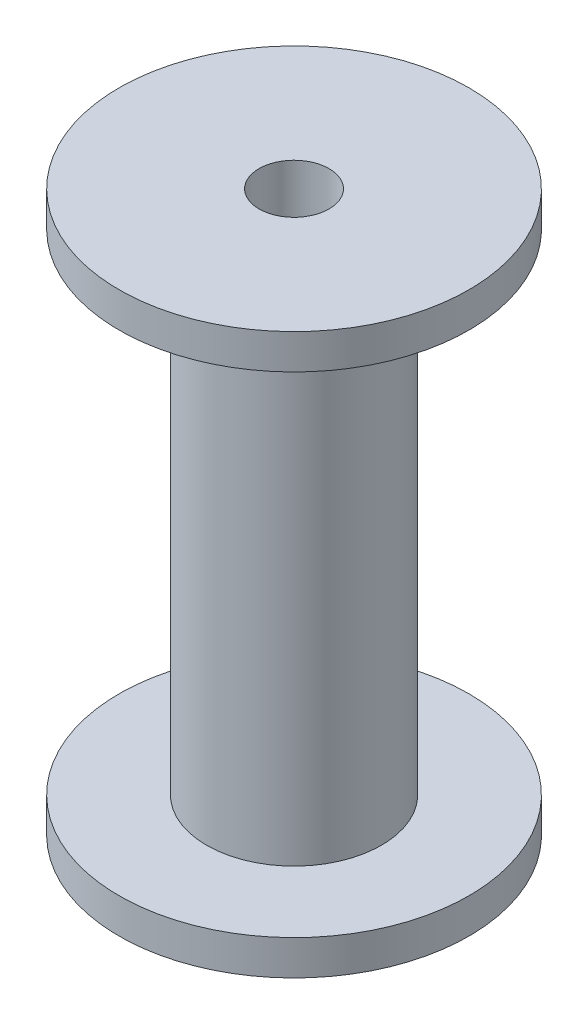
ISO-10303-21;
HEADER;
FILE_DESCRIPTION(('STEP AP214'),'2;1');
FILE_NAME('part.step','',(''),(''),'','','');
FILE_SCHEMA(('AUTOMOTIVE_DESIGN { 1 0 10303 214 1 1 1 1 }'));
ENDSEC;
DATA;
#1=APPLICATION_CONTEXT('core data for automotive mechanical design processes');
#2=APPLICATION_PROTOCOL_DEFINITION('international standard','automotive_design',2000,#1);
#3=PRODUCT_CONTEXT('',#1,'mechanical');
#4=PRODUCT('Part','Part','',(#3));
#5=PRODUCT_RELATED_PRODUCT_CATEGORY('part','',(#4));
#6=PRODUCT_DEFINITION_FORMATION('','',#4);
#7=PRODUCT_DEFINITION_CONTEXT('part definition',#1,'design');
#8=PRODUCT_DEFINITION('design','',#6,#7);
#9=PRODUCT_DEFINITION_SHAPE('','',#8);
#10=(LENGTH_UNIT() NAMED_UNIT(*) SI_UNIT(.MILLI.,.METRE.));
#11=(NAMED_UNIT(*) PLANE_ANGLE_UNIT() SI_UNIT($,.RADIAN.));
#12=(NAMED_UNIT(*) SI_UNIT($,.STERADIAN.) SOLID_ANGLE_UNIT());
#13=UNCERTAINTY_MEASURE_WITH_UNIT(LENGTH_MEASURE(1.E-05),#10,'distance_accuracy_value','');
#14=(GEOMETRIC_REPRESENTATION_CONTEXT(3) GLOBAL_UNCERTAINTY_ASSIGNED_CONTEXT((#13)) GLOBAL_UNIT_ASSIGNED_CONTEXT((#10,
#11,#12)) REPRESENTATION_CONTEXT('',''));
#15=CARTESIAN_POINT('',(0.,0.,0.));
#16=DIRECTION('',(0.,0.,1.));
#17=DIRECTION('',(1.,0.,0.));
#18=AXIS2_PLACEMENT_3D('',#15,#16,#17);
#19=CARTESIAN_POINT('',(63.5,0.,0.));
#20=DIRECTION('',(0.,-1.,0.));
#21=DIRECTION('',(0.,0.,-1.));
#22=AXIS2_PLACEMENT_3D('',#19,#20,#21);
#23=PLANE('',#22);
#24=CARTESIAN_POINT('',(0.,0.,0.));
#25=DIRECTION('',(0.,1.,0.));
#26=DIRECTION('',(0.,0.,1.));
#27=AXIS2_PLACEMENT_3D('',#24,#25,#26);
#28=CIRCLE('',#27,12.7);
#29=CARTESIAN_POINT('',(0.,0.,12.7));
#30=VERTEX_POINT('',#29);
#31=EDGE_CURVE('E57',#30,#30,#28,.T.);
#32=ORIENTED_EDGE('',*,*,#31,.T.);
#33=EDGE_LOOP('',(#32));
#34=FACE_BOUND('',#33,.T.);
#35=CARTESIAN_POINT('',(0.,0.,0.));
#36=DIRECTION('',(0.,-1.,0.));
#37=DIRECTION('',(0.,0.,-1.));
#38=AXIS2_PLACEMENT_3D('',#35,#36,#37);
#39=CIRCLE('',#38,63.5);
#40=CARTESIAN_POINT('',(0.,0.,-63.5));
#41=VERTEX_POINT('',#40);
#42=EDGE_CURVE('E54',#41,#41,#39,.T.);
#43=ORIENTED_EDGE('',*,*,#42,.T.);
#44=EDGE_LOOP('',(#43));
#45=FACE_BOUND('',#44,.T.);
#46=ADVANCED_FACE('F32',(#34,#45),#23,.T.);
#47=CARTESIAN_POINT('',(0.,203.2,0.));
#48=DIRECTION('',(0.,1.,0.));
#49=DIRECTION('',(0.,0.,1.));
#50=AXIS2_PLACEMENT_3D('',#47,#48,#49);
#51=PLANE('',#50);
#52=CARTESIAN_POINT('',(0.,203.2,0.));
#53=DIRECTION('',(0.,1.,0.));
#54=DIRECTION('',(0.,0.,1.));
#55=AXIS2_PLACEMENT_3D('',#52,#53,#54);
#56=CIRCLE('',#55,12.7);
#57=CARTESIAN_POINT('',(0.,203.2,12.7));
#58=VERTEX_POINT('',#57);
#59=EDGE_CURVE('E58',#58,#58,#56,.T.);
#60=ORIENTED_EDGE('',*,*,#59,.F.);
#61=EDGE_LOOP('',(#60));
#62=FACE_BOUND('',#61,.T.);
#63=CARTESIAN_POINT('',(0.,203.2,0.));
#64=DIRECTION('',(0.,-1.,0.));
#65=DIRECTION('',(0.,0.,-1.));
#66=AXIS2_PLACEMENT_3D('',#63,#64,#65);
#67=CIRCLE('',#66,63.5);
#68=CARTESIAN_POINT('',(0.,203.2,-63.5));
#69=VERTEX_POINT('',#68);
#70=EDGE_CURVE('E10',#69,#69,#67,.T.);
#71=ORIENTED_EDGE('',*,*,#70,.F.);
#72=EDGE_LOOP('',(#71));
#73=FACE_BOUND('',#72,.T.);
#74=ADVANCED_FACE('F73',(#62,#73),#51,.T.);
#75=CARTESIAN_POINT('',(0.,0.,0.));
#76=DIRECTION('',(0.,-1.,0.));
#77=DIRECTION('',(0.,0.,-1.));
#78=AXIS2_PLACEMENT_3D('',#75,#76,#77);
#79=CYLINDRICAL_SURFACE('',#78,63.5);
#80=ORIENTED_EDGE('',*,*,#70,.T.);
#81=EDGE_LOOP('',(#80));
#82=FACE_BOUND('',#81,.T.);
#83=CARTESIAN_POINT('',(0.,190.5,0.));
#84=DIRECTION('',(0.,-1.,0.));
#85=DIRECTION('',(0.,0.,-1.));
#86=AXIS2_PLACEMENT_3D('',#83,#84,#85);
#87=CIRCLE('',#86,63.5);
#88=CARTESIAN_POINT('',(0.,190.5,-63.5));
#89=VERTEX_POINT('',#88);
#90=EDGE_CURVE('E38',#89,#89,#87,.T.);
#91=ORIENTED_EDGE('',*,*,#90,.F.);
#92=EDGE_LOOP('',(#91));
#93=FACE_BOUND('',#92,.T.);
#94=ADVANCED_FACE('F76',(#82,#93),#79,.T.);
#95=CARTESIAN_POINT('',(63.5,190.5,0.));
#96=DIRECTION('',(0.,-1.,0.));
#97=DIRECTION('',(0.,0.,-1.));
#98=AXIS2_PLACEMENT_3D('',#95,#96,#97);
#99=PLANE('',#98);
#100=ORIENTED_EDGE('',*,*,#90,.T.);
#101=EDGE_LOOP('',(#100));
#102=FACE_BOUND('',#101,.T.);
#103=CARTESIAN_POINT('',(0.,190.5,0.));
#104=DIRECTION('',(0.,-1.,0.));
#105=DIRECTION('',(0.,0.,-1.));
#106=AXIS2_PLACEMENT_3D('',#103,#104,#105);
#107=CIRCLE('',#106,31.75);
#108=CARTESIAN_POINT('',(0.,190.5,-31.75));
#109=VERTEX_POINT('',#108);
#110=EDGE_CURVE('E42',#109,#109,#107,.T.);
#111=ORIENTED_EDGE('',*,*,#110,.F.);
#112=EDGE_LOOP('',(#111));
#113=FACE_BOUND('',#112,.T.);
#114=ADVANCED_FACE('F81',(#102,#113),#99,.T.);
#115=CARTESIAN_POINT('',(0.,0.,0.));
#116=DIRECTION('',(0.,-1.,0.));
#117=DIRECTION('',(0.,0.,-1.));
#118=AXIS2_PLACEMENT_3D('',#115,#116,#117);
#119=CYLINDRICAL_SURFACE('',#118,31.75);
#120=ORIENTED_EDGE('',*,*,#110,.T.);
#121=EDGE_LOOP('',(#120));
#122=FACE_BOUND('',#121,.T.);
#123=CARTESIAN_POINT('',(0.,12.7,0.));
#124=DIRECTION('',(0.,-1.,0.));
#125=DIRECTION('',(0.,0.,-1.));
#126=AXIS2_PLACEMENT_3D('',#123,#124,#125);
#127=CIRCLE('',#126,31.75);
#128=CARTESIAN_POINT('',(0.,12.7,-31.75));
#129=VERTEX_POINT('',#128);
#130=EDGE_CURVE('E46',#129,#129,#127,.T.);
#131=ORIENTED_EDGE('',*,*,#130,.F.);
#132=EDGE_LOOP('',(#131));
#133=FACE_BOUND('',#132,.T.);
#134=ADVANCED_FACE('F86',(#122,#133),#119,.T.);
#135=CARTESIAN_POINT('',(31.75,12.7,0.));
#136=DIRECTION('',(0.,1.,0.));
#137=DIRECTION('',(0.,0.,1.));
#138=AXIS2_PLACEMENT_3D('',#135,#136,#137);
#139=PLANE('',#138);
#140=ORIENTED_EDGE('',*,*,#130,.T.);
#141=EDGE_LOOP('',(#140));
#142=FACE_BOUND('',#141,.T.);
#143=CARTESIAN_POINT('',(0.,12.7,0.));
#144=DIRECTION('',(0.,-1.,0.));
#145=DIRECTION('',(0.,0.,-1.));
#146=AXIS2_PLACEMENT_3D('',#143,#144,#145);
#147=CIRCLE('',#146,63.5);
#148=CARTESIAN_POINT('',(0.,12.7,-63.5));
#149=VERTEX_POINT('',#148);
#150=EDGE_CURVE('E51',#149,#149,#147,.T.);
#151=ORIENTED_EDGE('',*,*,#150,.F.);
#152=EDGE_LOOP('',(#151));
#153=FACE_BOUND('',#152,.T.);
#154=ADVANCED_FACE('F89',(#142,#153),#139,.T.);
#155=CARTESIAN_POINT('',(0.,0.,0.));
#156=DIRECTION('',(0.,-1.,0.));
#157=DIRECTION('',(0.,0.,-1.));
#158=AXIS2_PLACEMENT_3D('',#155,#156,#157);
#159=CYLINDRICAL_SURFACE('',#158,63.5);
#160=ORIENTED_EDGE('',*,*,#150,.T.);
#161=EDGE_LOOP('',(#160));
#162=FACE_BOUND('',#161,.T.);
#163=ORIENTED_EDGE('',*,*,#42,.F.);
#164=EDGE_LOOP('',(#163));
#165=FACE_BOUND('',#164,.T.);
#166=ADVANCED_FACE('F69',(#162,#165),#159,.T.);
#167=CARTESIAN_POINT('',(0.,0.,0.));
#168=DIRECTION('',(0.,1.,0.));
#169=DIRECTION('',(0.,0.,1.));
#170=AXIS2_PLACEMENT_3D('',#167,#168,#169);
#171=CYLINDRICAL_SURFACE('',#170,12.7);
#172=ORIENTED_EDGE('',*,*,#31,.F.);
#173=EDGE_LOOP('',(#172));
#174=FACE_BOUND('',#173,.T.);
#175=ORIENTED_EDGE('',*,*,#59,.T.);
#176=EDGE_LOOP('',(#175));
#177=FACE_BOUND('',#176,.T.);
#178=ADVANCED_FACE('F66',(#174,#177),#171,.F.);
#179=CLOSED_SHELL('',(#46,#74,#94,#114,#134,#154,#166,#178));
#180=MANIFOLD_SOLID_BREP('B2',#179);
#181=ADVANCED_BREP_SHAPE_REPRESENTATION('',(#18,#180),#14);
#182=SHAPE_DEFINITION_REPRESENTATION(#9,#181);
ENDSEC;
END-ISO-10303-21;
